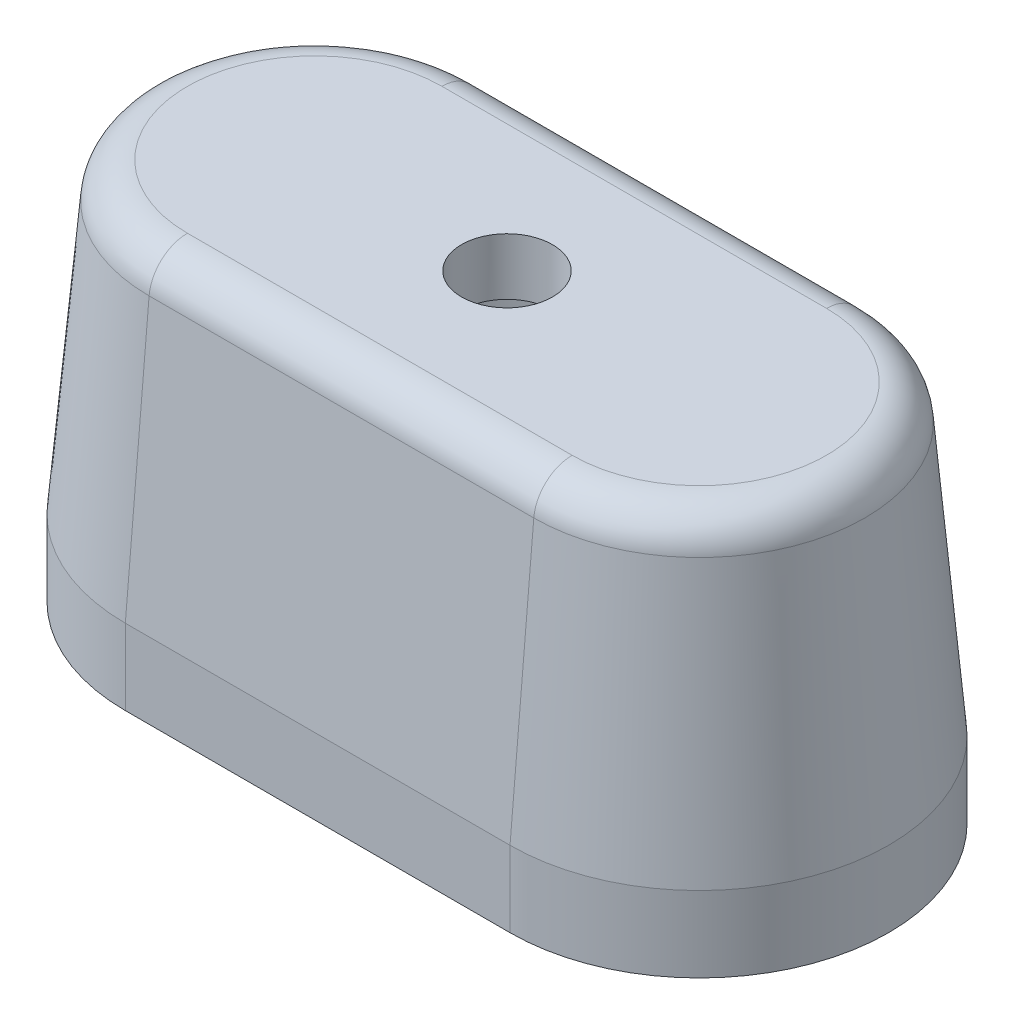
ISO-10303-21;
HEADER;
FILE_DESCRIPTION(('STEP AP214'),'2;1');
FILE_NAME('part.step','',(''),(''),'','','');
FILE_SCHEMA(('AUTOMOTIVE_DESIGN { 1 0 10303 214 1 1 1 1 }'));
ENDSEC;
DATA;
#1=APPLICATION_CONTEXT('core data for automotive mechanical design processes');
#2=APPLICATION_PROTOCOL_DEFINITION('international standard','automotive_design',2000,#1);
#3=PRODUCT_CONTEXT('',#1,'mechanical');
#4=PRODUCT('Part','Part','',(#3));
#5=PRODUCT_RELATED_PRODUCT_CATEGORY('part','',(#4));
#6=PRODUCT_DEFINITION_FORMATION('','',#4);
#7=PRODUCT_DEFINITION_CONTEXT('part definition',#1,'design');
#8=PRODUCT_DEFINITION('design','',#6,#7);
#9=PRODUCT_DEFINITION_SHAPE('','',#8);
#10=(LENGTH_UNIT() NAMED_UNIT(*) SI_UNIT(.MILLI.,.METRE.));
#11=(NAMED_UNIT(*) PLANE_ANGLE_UNIT() SI_UNIT($,.RADIAN.));
#12=(NAMED_UNIT(*) SI_UNIT($,.STERADIAN.) SOLID_ANGLE_UNIT());
#13=UNCERTAINTY_MEASURE_WITH_UNIT(LENGTH_MEASURE(1.E-05),#10,'distance_accuracy_value','');
#14=(GEOMETRIC_REPRESENTATION_CONTEXT(3) GLOBAL_UNCERTAINTY_ASSIGNED_CONTEXT((#13)) GLOBAL_UNIT_ASSIGNED_CONTEXT((#10,
#11,#12)) REPRESENTATION_CONTEXT('',''));
#15=CARTESIAN_POINT('',(0.,0.,0.));
#16=DIRECTION('',(0.,0.,1.));
#17=DIRECTION('',(1.,0.,0.));
#18=AXIS2_PLACEMENT_3D('',#15,#16,#17);
#19=CARTESIAN_POINT('',(0.,0.,0.));
#20=DIRECTION('',(0.,-1.,0.));
#21=DIRECTION('',(0.,0.,-1.));
#22=AXIS2_PLACEMENT_3D('',#19,#20,#21);
#23=PLANE('',#22);
#24=CARTESIAN_POINT('',(0.,0.,0.));
#25=DIRECTION('',(0.,-1.,0.));
#26=DIRECTION('',(0.,0.,-1.));
#27=AXIS2_PLACEMENT_3D('',#24,#25,#26);
#28=CIRCLE('',#27,21.25);
#29=CARTESIAN_POINT('',(0.,0.,-21.25));
#30=VERTEX_POINT('',#29);
#31=EDGE_CURVE('E158',#30,#30,#28,.T.);
#32=ORIENTED_EDGE('',*,*,#31,.F.);
#33=EDGE_LOOP('',(#32));
#34=FACE_BOUND('',#33,.T.);
#35=DIRECTION('',(1.,0.,0.));
#36=VECTOR('',#35,1.);
#37=CARTESIAN_POINT('',(-25.4,0.,25.000000038));
#38=LINE('',#37,#36);
#39=CARTESIAN_POINT('',(-25.4,0.,25.000000038));
#40=VERTEX_POINT('',#39);
#41=CARTESIAN_POINT('',(25.4,0.,25.000000038));
#42=VERTEX_POINT('',#41);
#43=EDGE_CURVE('E136',#40,#42,#38,.T.);
#44=ORIENTED_EDGE('',*,*,#43,.F.);
#45=CARTESIAN_POINT('',(-25.4,0.,0.));
#46=DIRECTION('',(0.,1.,0.));
#47=DIRECTION('',(0.,0.,1.));
#48=AXIS2_PLACEMENT_3D('',#45,#46,#47);
#49=CIRCLE('',#48,25.000000038);
#50=CARTESIAN_POINT('',(-25.4,0.,-25.000000038));
#51=VERTEX_POINT('',#50);
#52=EDGE_CURVE('E64',#51,#40,#49,.T.);
#53=ORIENTED_EDGE('',*,*,#52,.F.);
#54=DIRECTION('',(-1.,0.,0.));
#55=VECTOR('',#54,1.);
#56=CARTESIAN_POINT('',(-25.4,0.,-25.000000038));
#57=LINE('',#56,#55);
#58=CARTESIAN_POINT('',(25.4,0.,-25.000000038));
#59=VERTEX_POINT('',#58);
#60=EDGE_CURVE('E119',#59,#51,#57,.T.);
#61=ORIENTED_EDGE('',*,*,#60,.F.);
#62=CARTESIAN_POINT('',(25.4,0.,0.));
#63=DIRECTION('',(0.,1.,0.));
#64=DIRECTION('',(0.,0.,1.));
#65=AXIS2_PLACEMENT_3D('',#62,#63,#64);
#66=CIRCLE('',#65,25.000000038);
#67=EDGE_CURVE('E130',#42,#59,#66,.T.);
#68=ORIENTED_EDGE('',*,*,#67,.F.);
#69=EDGE_LOOP('',(#44,#53,#61,#68));
#70=FACE_BOUND('',#69,.T.);
#71=ADVANCED_FACE('F46',(#34,#70),#23,.T.);
#72=CARTESIAN_POINT('',(-25.4,10.,0.));
#73=DIRECTION('',(0.,-1.,0.));
#74=DIRECTION('',(0.,0.,1.));
#75=AXIS2_PLACEMENT_3D('',#72,#73,#74);
#76=CONICAL_SURFACE('',#75,25.000000038,0.0872664625997167);
#77=DIRECTION('',(0.,-0.996194698091745,0.0871557427476583));
#78=VECTOR('',#77,1.);
#79=CARTESIAN_POINT('',(-25.4,10.,25.000000038));
#80=LINE('',#79,#78);
#81=CARTESIAN_POINT('',(-25.4,45.8627511731581,21.8624158674976));
#82=VERTEX_POINT('',#81);
#83=CARTESIAN_POINT('',(-25.4,10.,25.000000038));
#84=VERTEX_POINT('',#83);
#85=EDGE_CURVE('E177',#82,#84,#80,.T.);
#86=ORIENTED_EDGE('',*,*,#85,.F.);
#87=CARTESIAN_POINT('',(-25.4,45.8627511731581,0.));
#88=DIRECTION('',(0.,-1.,0.));
#89=DIRECTION('',(0.,0.,-1.));
#90=AXIS2_PLACEMENT_3D('',#87,#88,#89);
#91=CIRCLE('',#90,21.8624158674976);
#92=CARTESIAN_POINT('',(-25.4,45.8627511731581,-21.8624158674976));
#93=VERTEX_POINT('',#92);
#94=EDGE_CURVE('E56',#82,#93,#91,.T.);
#95=ORIENTED_EDGE('',*,*,#94,.T.);
#96=DIRECTION('',(0.,-0.996194698091745,-0.0871557427476584));
#97=VECTOR('',#96,1.);
#98=CARTESIAN_POINT('',(-25.4,10.,-25.000000038));
#99=LINE('',#98,#97);
#100=CARTESIAN_POINT('',(-25.4,10.,-25.000000038));
#101=VERTEX_POINT('',#100);
#102=EDGE_CURVE('E176',#93,#101,#99,.T.);
#103=ORIENTED_EDGE('',*,*,#102,.T.);
#104=CARTESIAN_POINT('',(-25.4,10.,0.));
#105=DIRECTION('',(0.,1.,0.));
#106=DIRECTION('',(0.,0.,1.));
#107=AXIS2_PLACEMENT_3D('',#104,#105,#106);
#108=CIRCLE('',#107,25.000000038);
#109=EDGE_CURVE('E157',#101,#84,#108,.T.);
#110=ORIENTED_EDGE('',*,*,#109,.T.);
#111=EDGE_LOOP('',(#86,#95,#103,#110));
#112=FACE_BOUND('',#111,.T.);
#113=ADVANCED_FACE('F249',(#112),#76,.T.);
#114=CARTESIAN_POINT('',(-25.4,10.,25.000000038));
#115=DIRECTION('',(0.,0.0871557427476584,0.996194698091745));
#116=DIRECTION('',(0.,-0.996194698091746,0.0871557427476584));
#117=AXIS2_PLACEMENT_3D('',#114,#115,#116);
#118=PLANE('',#117);
#119=DIRECTION('',(0.,-0.996194698091745,0.0871557427476584));
#120=VECTOR('',#119,1.);
#121=CARTESIAN_POINT('',(25.4,10.,25.000000038));
#122=LINE('',#121,#120);
#123=CARTESIAN_POINT('',(25.4,45.8627511731581,21.8624158674976));
#124=VERTEX_POINT('',#123);
#125=CARTESIAN_POINT('',(25.4,10.,25.000000038));
#126=VERTEX_POINT('',#125);
#127=EDGE_CURVE('E182',#124,#126,#122,.T.);
#128=ORIENTED_EDGE('',*,*,#127,.F.);
#129=DIRECTION('',(1.,0.,0.));
#130=VECTOR('',#129,1.);
#131=CARTESIAN_POINT('',(-25.4,45.8627511731581,21.8624158674976));
#132=LINE('',#131,#130);
#133=EDGE_CURVE('E203',#124,#82,#132,.F.);
#134=ORIENTED_EDGE('',*,*,#133,.T.);
#135=ORIENTED_EDGE('',*,*,#85,.T.);
#136=DIRECTION('',(1.,0.,0.));
#137=VECTOR('',#136,1.);
#138=CARTESIAN_POINT('',(-25.4,10.,25.000000038));
#139=LINE('',#138,#137);
#140=EDGE_CURVE('E166',#84,#126,#139,.T.);
#141=ORIENTED_EDGE('',*,*,#140,.T.);
#142=EDGE_LOOP('',(#128,#134,#135,#141));
#143=FACE_BOUND('',#142,.T.);
#144=ADVANCED_FACE('F242',(#143),#118,.T.);
#145=CARTESIAN_POINT('',(25.4,10.,0.));
#146=DIRECTION('',(0.,-1.,0.));
#147=DIRECTION('',(0.,0.,1.));
#148=AXIS2_PLACEMENT_3D('',#145,#146,#147);
#149=CONICAL_SURFACE('',#148,25.000000038,0.0872664625997167);
#150=DIRECTION('',(0.,-0.996194698091745,-0.0871557427476584));
#151=VECTOR('',#150,1.);
#152=CARTESIAN_POINT('',(25.4,10.,-25.000000038));
#153=LINE('',#152,#151);
#154=CARTESIAN_POINT('',(25.4,45.8627511731581,-21.8624158674976));
#155=VERTEX_POINT('',#154);
#156=CARTESIAN_POINT('',(25.4,10.,-25.000000038));
#157=VERTEX_POINT('',#156);
#158=EDGE_CURVE('E185',#155,#157,#153,.T.);
#159=ORIENTED_EDGE('',*,*,#158,.F.);
#160=CARTESIAN_POINT('',(25.4,45.8627511731581,0.));
#161=DIRECTION('',(0.,-1.,0.));
#162=DIRECTION('',(0.,0.,-1.));
#163=AXIS2_PLACEMENT_3D('',#160,#161,#162);
#164=CIRCLE('',#163,21.8624158674976);
#165=EDGE_CURVE('E207',#155,#124,#164,.T.);
#166=ORIENTED_EDGE('',*,*,#165,.T.);
#167=ORIENTED_EDGE('',*,*,#127,.T.);
#168=CARTESIAN_POINT('',(25.4,10.,0.));
#169=DIRECTION('',(0.,1.,0.));
#170=DIRECTION('',(0.,0.,1.));
#171=AXIS2_PLACEMENT_3D('',#168,#169,#170);
#172=CIRCLE('',#171,25.000000038);
#173=EDGE_CURVE('E170',#126,#157,#172,.T.);
#174=ORIENTED_EDGE('',*,*,#173,.T.);
#175=EDGE_LOOP('',(#159,#166,#167,#174));
#176=FACE_BOUND('',#175,.T.);
#177=ADVANCED_FACE('F237',(#176),#149,.T.);
#178=CARTESIAN_POINT('',(-25.4,10.,-25.000000038));
#179=DIRECTION('',(0.,0.0871557427476584,-0.996194698091746));
#180=DIRECTION('',(0.,0.996194698091746,0.0871557427476584));
#181=AXIS2_PLACEMENT_3D('',#178,#179,#180);
#182=PLANE('',#181);
#183=ORIENTED_EDGE('',*,*,#102,.F.);
#184=DIRECTION('',(-1.,0.,0.));
#185=VECTOR('',#184,1.);
#186=CARTESIAN_POINT('',(25.4,45.8627511731581,-21.8624158674976));
#187=LINE('',#186,#185);
#188=EDGE_CURVE('E12',#93,#155,#187,.F.);
#189=ORIENTED_EDGE('',*,*,#188,.T.);
#190=ORIENTED_EDGE('',*,*,#158,.T.);
#191=DIRECTION('',(-1.,0.,0.));
#192=VECTOR('',#191,1.);
#193=CARTESIAN_POINT('',(-25.4,10.,-25.000000038));
#194=LINE('',#193,#192);
#195=EDGE_CURVE('E121',#157,#101,#194,.T.);
#196=ORIENTED_EDGE('',*,*,#195,.T.);
#197=EDGE_LOOP('',(#183,#189,#190,#196));
#198=FACE_BOUND('',#197,.T.);
#199=ADVANCED_FACE('F235',(#198),#182,.T.);
#200=CARTESIAN_POINT('',(-25.4,50.5,0.));
#201=DIRECTION('',(0.,1.,0.));
#202=DIRECTION('',(0.,0.,1.));
#203=AXIS2_PLACEMENT_3D('',#200,#201,#202);
#204=PLANE('',#203);
#205=CARTESIAN_POINT('',(0.,50.5,0.));
#206=DIRECTION('',(0.,1.,0.));
#207=DIRECTION('',(0.,0.,1.));
#208=AXIS2_PLACEMENT_3D('',#205,#206,#207);
#209=CIRCLE('',#208,6.);
#210=CARTESIAN_POINT('',(0.,50.5,6.));
#211=VERTEX_POINT('',#210);
#212=EDGE_CURVE('E146',#211,#211,#209,.T.);
#213=ORIENTED_EDGE('',*,*,#212,.F.);
#214=EDGE_LOOP('',(#213));
#215=FACE_BOUND('',#214,.T.);
#216=CARTESIAN_POINT('',(-25.4,50.5,0.));
#217=DIRECTION('',(0.,1.,0.));
#218=DIRECTION('',(0.,0.,1.));
#219=AXIS2_PLACEMENT_3D('',#216,#217,#218);
#220=CIRCLE('',#219,16.8017468011916);
#221=CARTESIAN_POINT('',(-25.4,50.5,-16.8017468011916));
#222=VERTEX_POINT('',#221);
#223=CARTESIAN_POINT('',(-25.4,50.5,16.8017468011916));
#224=VERTEX_POINT('',#223);
#225=EDGE_CURVE('E193',#222,#224,#220,.T.);
#226=ORIENTED_EDGE('',*,*,#225,.T.);
#227=DIRECTION('',(-1.,0.,0.));
#228=VECTOR('',#227,1.);
#229=CARTESIAN_POINT('',(25.4,50.5,16.8017468011916));
#230=LINE('',#229,#228);
#231=CARTESIAN_POINT('',(25.4,50.5,16.8017468011916));
#232=VERTEX_POINT('',#231);
#233=EDGE_CURVE('E199',#224,#232,#230,.F.);
#234=ORIENTED_EDGE('',*,*,#233,.T.);
#235=CARTESIAN_POINT('',(25.4,50.5,0.));
#236=DIRECTION('',(0.,1.,0.));
#237=DIRECTION('',(0.,0.,1.));
#238=AXIS2_PLACEMENT_3D('',#235,#236,#237);
#239=CIRCLE('',#238,16.8017468011916);
#240=CARTESIAN_POINT('',(25.4,50.5,-16.8017468011916));
#241=VERTEX_POINT('',#240);
#242=EDGE_CURVE('E196',#232,#241,#239,.T.);
#243=ORIENTED_EDGE('',*,*,#242,.T.);
#244=DIRECTION('',(1.,0.,0.));
#245=VECTOR('',#244,1.);
#246=CARTESIAN_POINT('',(-25.4,50.5,-16.8017468011916));
#247=LINE('',#246,#245);
#248=EDGE_CURVE('E181',#241,#222,#247,.F.);
#249=ORIENTED_EDGE('',*,*,#248,.T.);
#250=EDGE_LOOP('',(#226,#234,#243,#249));
#251=FACE_BOUND('',#250,.T.);
#252=ADVANCED_FACE('F261',(#215,#251),#204,.T.);
#253=CARTESIAN_POINT('',(0.,43.,0.));
#254=DIRECTION('',(0.,-1.,0.));
#255=DIRECTION('',(0.,0.,-1.));
#256=AXIS2_PLACEMENT_3D('',#253,#254,#255);
#257=CYLINDRICAL_SURFACE('',#256,21.25);
#258=CARTESIAN_POINT('',(0.,43.,0.));
#259=DIRECTION('',(0.,-1.,0.));
#260=DIRECTION('',(0.,0.,-1.));
#261=AXIS2_PLACEMENT_3D('',#258,#259,#260);
#262=CIRCLE('',#261,21.25);
#263=CARTESIAN_POINT('',(0.,43.,-21.25));
#264=VERTEX_POINT('',#263);
#265=EDGE_CURVE('E153',#264,#264,#262,.T.);
#266=ORIENTED_EDGE('',*,*,#265,.F.);
#267=EDGE_LOOP('',(#266));
#268=FACE_BOUND('',#267,.T.);
#269=ORIENTED_EDGE('',*,*,#31,.T.);
#270=EDGE_LOOP('',(#269));
#271=FACE_BOUND('',#270,.T.);
#272=ADVANCED_FACE('F284',(#268,#271),#257,.F.);
#273=CARTESIAN_POINT('',(0.,43.,0.));
#274=DIRECTION('',(0.,-1.,0.));
#275=DIRECTION('',(0.,0.,-1.));
#276=AXIS2_PLACEMENT_3D('',#273,#274,#275);
#277=PLANE('',#276);
#278=CARTESIAN_POINT('',(0.,43.,0.));
#279=DIRECTION('',(0.,-1.,0.));
#280=DIRECTION('',(0.,0.,-1.));
#281=AXIS2_PLACEMENT_3D('',#278,#279,#280);
#282=CIRCLE('',#281,6.);
#283=CARTESIAN_POINT('',(0.,43.,-6.));
#284=VERTEX_POINT('',#283);
#285=EDGE_CURVE('E50',#284,#284,#282,.T.);
#286=ORIENTED_EDGE('',*,*,#285,.F.);
#287=EDGE_LOOP('',(#286));
#288=FACE_BOUND('',#287,.T.);
#289=ORIENTED_EDGE('',*,*,#265,.T.);
#290=EDGE_LOOP('',(#289));
#291=FACE_BOUND('',#290,.T.);
#292=ADVANCED_FACE('F279',(#288,#291),#277,.T.);
#293=CARTESIAN_POINT('',(-25.4,45.42,-16.8017468011916));
#294=DIRECTION('',(-1.,0.,0.));
#295=DIRECTION('',(0.,0.,1.));
#296=AXIS2_PLACEMENT_3D('',#293,#294,#295);
#297=CYLINDRICAL_SURFACE('',#296,5.08);
#298=CARTESIAN_POINT('',(25.4,45.42,-16.8017468011916));
#299=DIRECTION('',(1.,0.,0.));
#300=DIRECTION('',(0.,0.,-1.));
#301=AXIS2_PLACEMENT_3D('',#298,#299,#300);
#302=CIRCLE('',#301,5.08);
#303=EDGE_CURVE('E218',#155,#241,#302,.T.);
#304=ORIENTED_EDGE('',*,*,#303,.F.);
#305=ORIENTED_EDGE('',*,*,#188,.F.);
#306=CARTESIAN_POINT('',(-25.4,45.42,-16.8017468011916));
#307=DIRECTION('',(-1.,0.,0.));
#308=DIRECTION('',(0.,0.,1.));
#309=AXIS2_PLACEMENT_3D('',#306,#307,#308);
#310=CIRCLE('',#309,5.08);
#311=EDGE_CURVE('E162',#222,#93,#310,.T.);
#312=ORIENTED_EDGE('',*,*,#311,.F.);
#313=ORIENTED_EDGE('',*,*,#248,.F.);
#314=EDGE_LOOP('',(#304,#305,#312,#313));
#315=FACE_BOUND('',#314,.T.);
#316=ADVANCED_FACE('F48',(#315),#297,.T.);
#317=CARTESIAN_POINT('',(-25.4,45.42,0.));
#318=DIRECTION('',(0.,1.,0.));
#319=DIRECTION('',(0.,0.,1.));
#320=AXIS2_PLACEMENT_3D('',#317,#318,#319);
#321=TOROIDAL_SURFACE('',#320,16.8017468011916,5.08);
#322=ORIENTED_EDGE('',*,*,#311,.T.);
#323=ORIENTED_EDGE('',*,*,#94,.F.);
#324=CARTESIAN_POINT('',(-25.4,45.42,16.8017468011916));
#325=DIRECTION('',(1.,0.,0.));
#326=DIRECTION('',(0.,0.,-1.));
#327=AXIS2_PLACEMENT_3D('',#324,#325,#326);
#328=CIRCLE('',#327,5.08);
#329=EDGE_CURVE('E215',#224,#82,#328,.T.);
#330=ORIENTED_EDGE('',*,*,#329,.F.);
#331=ORIENTED_EDGE('',*,*,#225,.F.);
#332=EDGE_LOOP('',(#322,#323,#330,#331));
#333=FACE_BOUND('',#332,.T.);
#334=ADVANCED_FACE('F226',(#333),#321,.T.);
#335=CARTESIAN_POINT('',(25.4,45.42,0.));
#336=DIRECTION('',(0.,1.,0.));
#337=DIRECTION('',(0.,0.,1.));
#338=AXIS2_PLACEMENT_3D('',#335,#336,#337);
#339=TOROIDAL_SURFACE('',#338,16.8017468011916,5.08);
#340=ORIENTED_EDGE('',*,*,#303,.T.);
#341=ORIENTED_EDGE('',*,*,#242,.F.);
#342=CARTESIAN_POINT('',(25.4,45.42,16.8017468011916));
#343=DIRECTION('',(-1.,0.,0.));
#344=DIRECTION('',(0.,0.,1.));
#345=AXIS2_PLACEMENT_3D('',#342,#343,#344);
#346=CIRCLE('',#345,5.08);
#347=EDGE_CURVE('E212',#124,#232,#346,.T.);
#348=ORIENTED_EDGE('',*,*,#347,.F.);
#349=ORIENTED_EDGE('',*,*,#165,.F.);
#350=EDGE_LOOP('',(#340,#341,#348,#349));
#351=FACE_BOUND('',#350,.T.);
#352=ADVANCED_FACE('F271',(#351),#339,.T.);
#353=CARTESIAN_POINT('',(-25.4,45.42,16.8017468011916));
#354=DIRECTION('',(1.,0.,0.));
#355=DIRECTION('',(0.,0.,-1.));
#356=AXIS2_PLACEMENT_3D('',#353,#354,#355);
#357=CYLINDRICAL_SURFACE('',#356,5.08);
#358=ORIENTED_EDGE('',*,*,#329,.T.);
#359=ORIENTED_EDGE('',*,*,#133,.F.);
#360=ORIENTED_EDGE('',*,*,#347,.T.);
#361=ORIENTED_EDGE('',*,*,#233,.F.);
#362=EDGE_LOOP('',(#358,#359,#360,#361));
#363=FACE_BOUND('',#362,.T.);
#364=ADVANCED_FACE('F267',(#363),#357,.T.);
#365=CARTESIAN_POINT('',(0.,0.,0.));
#366=DIRECTION('',(0.,1.,0.));
#367=DIRECTION('',(0.,0.,1.));
#368=AXIS2_PLACEMENT_3D('',#365,#366,#367);
#369=CYLINDRICAL_SURFACE('',#368,6.);
#370=ORIENTED_EDGE('',*,*,#285,.T.);
#371=EDGE_LOOP('',(#370));
#372=FACE_BOUND('',#371,.T.);
#373=ORIENTED_EDGE('',*,*,#212,.T.);
#374=EDGE_LOOP('',(#373));
#375=FACE_BOUND('',#374,.T.);
#376=ADVANCED_FACE('F270',(#372,#375),#369,.F.);
#377=CARTESIAN_POINT('',(-25.4,0.,0.));
#378=DIRECTION('',(0.,1.,0.));
#379=DIRECTION('',(0.,0.,1.));
#380=AXIS2_PLACEMENT_3D('',#377,#378,#379);
#381=CYLINDRICAL_SURFACE('',#380,25.000000038);
#382=ORIENTED_EDGE('',*,*,#109,.F.);
#383=DIRECTION('',(0.,1.,0.));
#384=VECTOR('',#383,1.);
#385=CARTESIAN_POINT('',(-25.4,0.,-25.000000038));
#386=LINE('',#385,#384);
#387=EDGE_CURVE('E126',#51,#101,#386,.T.);
#388=ORIENTED_EDGE('',*,*,#387,.F.);
#389=ORIENTED_EDGE('',*,*,#52,.T.);
#390=DIRECTION('',(0.,1.,0.));
#391=VECTOR('',#390,1.);
#392=CARTESIAN_POINT('',(-25.4,0.,25.000000038));
#393=LINE('',#392,#391);
#394=EDGE_CURVE('E139',#40,#84,#393,.T.);
#395=ORIENTED_EDGE('',*,*,#394,.T.);
#396=EDGE_LOOP('',(#382,#388,#389,#395));
#397=FACE_BOUND('',#396,.T.);
#398=ADVANCED_FACE('F248',(#397),#381,.T.);
#399=CARTESIAN_POINT('',(-25.4,0.,-25.000000038));
#400=DIRECTION('',(0.,0.,-1.));
#401=DIRECTION('',(-1.,0.,0.));
#402=AXIS2_PLACEMENT_3D('',#399,#400,#401);
#403=PLANE('',#402);
#404=ORIENTED_EDGE('',*,*,#195,.F.);
#405=DIRECTION('',(0.,1.,0.));
#406=VECTOR('',#405,1.);
#407=CARTESIAN_POINT('',(25.4,0.,-25.000000038));
#408=LINE('',#407,#406);
#409=EDGE_CURVE('E114',#59,#157,#408,.T.);
#410=ORIENTED_EDGE('',*,*,#409,.F.);
#411=ORIENTED_EDGE('',*,*,#60,.T.);
#412=ORIENTED_EDGE('',*,*,#387,.T.);
#413=EDGE_LOOP('',(#404,#410,#411,#412));
#414=FACE_BOUND('',#413,.T.);
#415=ADVANCED_FACE('F116',(#414),#403,.T.);
#416=CARTESIAN_POINT('',(25.4,0.,0.));
#417=DIRECTION('',(0.,1.,0.));
#418=DIRECTION('',(0.,0.,1.));
#419=AXIS2_PLACEMENT_3D('',#416,#417,#418);
#420=CYLINDRICAL_SURFACE('',#419,25.000000038);
#421=ORIENTED_EDGE('',*,*,#173,.F.);
#422=DIRECTION('',(0.,1.,0.));
#423=VECTOR('',#422,1.);
#424=CARTESIAN_POINT('',(25.4,0.,25.000000038));
#425=LINE('',#424,#423);
#426=EDGE_CURVE('E127',#42,#126,#425,.T.);
#427=ORIENTED_EDGE('',*,*,#426,.F.);
#428=ORIENTED_EDGE('',*,*,#67,.T.);
#429=ORIENTED_EDGE('',*,*,#409,.T.);
#430=EDGE_LOOP('',(#421,#427,#428,#429));
#431=FACE_BOUND('',#430,.T.);
#432=ADVANCED_FACE('F131',(#431),#420,.T.);
#433=CARTESIAN_POINT('',(-25.4,0.,25.000000038));
#434=DIRECTION('',(0.,0.,1.));
#435=DIRECTION('',(1.,0.,0.));
#436=AXIS2_PLACEMENT_3D('',#433,#434,#435);
#437=PLANE('',#436);
#438=ORIENTED_EDGE('',*,*,#140,.F.);
#439=ORIENTED_EDGE('',*,*,#394,.F.);
#440=ORIENTED_EDGE('',*,*,#43,.T.);
#441=ORIENTED_EDGE('',*,*,#426,.T.);
#442=EDGE_LOOP('',(#438,#439,#440,#441));
#443=FACE_BOUND('',#442,.T.);
#444=ADVANCED_FACE('F244',(#443),#437,.T.);
#445=CLOSED_SHELL('',(#71,#113,#144,#177,#199,#252,#272,#292,#316,#334,#352,#364,#376,#398,#415,
#432,#444));
#446=MANIFOLD_SOLID_BREP('B2',#445);
#447=ADVANCED_BREP_SHAPE_REPRESENTATION('',(#18,#446),#14);
#448=SHAPE_DEFINITION_REPRESENTATION(#9,#447);
ENDSEC;
END-ISO-10303-21;
